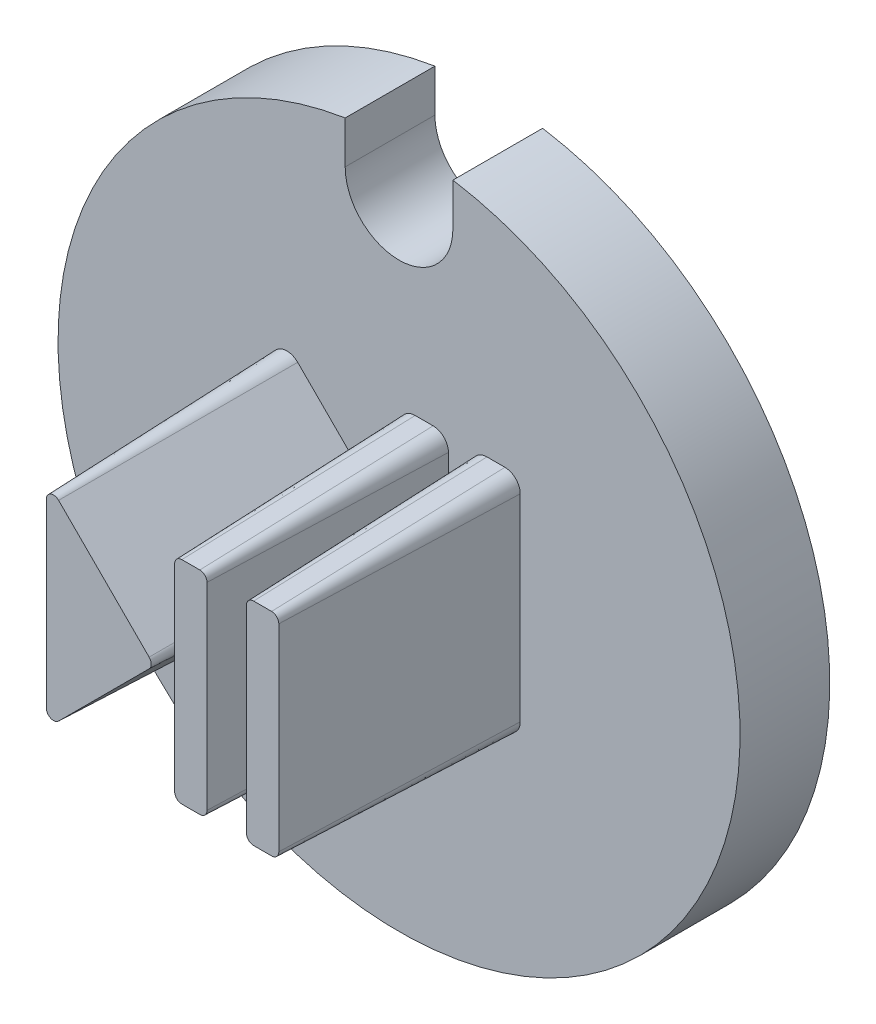
ISO-10303-21;
HEADER;
FILE_DESCRIPTION(('STEP AP214'),'2;1');
FILE_NAME('part.step','',(''),(''),'','','');
FILE_SCHEMA(('AUTOMOTIVE_DESIGN { 1 0 10303 214 1 1 1 1 }'));
ENDSEC;
DATA;
#1=APPLICATION_CONTEXT('core data for automotive mechanical design processes');
#2=APPLICATION_PROTOCOL_DEFINITION('international standard','automotive_design',2000,#1);
#3=PRODUCT_CONTEXT('',#1,'mechanical');
#4=PRODUCT('Part','Part','',(#3));
#5=PRODUCT_RELATED_PRODUCT_CATEGORY('part','',(#4));
#6=PRODUCT_DEFINITION_FORMATION('','',#4);
#7=PRODUCT_DEFINITION_CONTEXT('part definition',#1,'design');
#8=PRODUCT_DEFINITION('design','',#6,#7);
#9=PRODUCT_DEFINITION_SHAPE('','',#8);
#10=(LENGTH_UNIT() NAMED_UNIT(*) SI_UNIT(.MILLI.,.METRE.));
#11=(NAMED_UNIT(*) PLANE_ANGLE_UNIT() SI_UNIT($,.RADIAN.));
#12=(NAMED_UNIT(*) SI_UNIT($,.STERADIAN.) SOLID_ANGLE_UNIT());
#13=UNCERTAINTY_MEASURE_WITH_UNIT(LENGTH_MEASURE(1.E-05),#10,'distance_accuracy_value','');
#14=(GEOMETRIC_REPRESENTATION_CONTEXT(3) GLOBAL_UNCERTAINTY_ASSIGNED_CONTEXT((#13)) GLOBAL_UNIT_ASSIGNED_CONTEXT((#10,
#11,#12)) REPRESENTATION_CONTEXT('',''));
#15=CARTESIAN_POINT('',(0.,0.,0.));
#16=DIRECTION('',(0.,0.,1.));
#17=DIRECTION('',(1.,0.,0.));
#18=AXIS2_PLACEMENT_3D('',#15,#16,#17);
#19=CARTESIAN_POINT('',(0.,-2.95,9.));
#20=DIRECTION('',(0.,-0.999390827019096,0.0348994967025009));
#21=DIRECTION('',(0.,-0.0348994967025009,-0.999390827019096));
#22=AXIS2_PLACEMENT_3D('',#19,#20,#21);
#23=PLANE('',#22);
#24=DIRECTION('',(1.,0.,0.));
#25=VECTOR('',#24,1.);
#26=CARTESIAN_POINT('',(0.,-3.17698500169636,2.5));
#27=LINE('',#26,#25);
#28=CARTESIAN_POINT('',(2.45,-3.17698500169711,2.50000000001251));
#29=VERTEX_POINT('',#28);
#30=CARTESIAN_POINT('',(2.95,-3.17698500169978,2.50000000001251));
#31=VERTEX_POINT('',#30);
#32=EDGE_CURVE('E188',#29,#31,#27,.T.);
#33=ORIENTED_EDGE('',*,*,#32,.T.);
#34=DIRECTION('',(0.,0.034899496702501,0.999390827019096));
#35=VECTOR('',#34,1.);
#36=CARTESIAN_POINT('',(2.95000000000107,-17428.7282633076,-499000.));
#37=LINE('',#36,#35);
#38=CARTESIAN_POINT('',(2.95,-2.95000000000204,9.00000000001091));
#39=VERTEX_POINT('',#38);
#40=EDGE_CURVE('E190',#39,#31,#37,.F.);
#41=ORIENTED_EDGE('',*,*,#40,.F.);
#42=DIRECTION('',(1.,0.,0.));
#43=VECTOR('',#42,1.);
#44=CARTESIAN_POINT('',(0.,-2.95,9.));
#45=LINE('',#44,#43);
#46=CARTESIAN_POINT('',(2.45,-2.94999999999961,9.00000000001091));
#47=VERTEX_POINT('',#46);
#48=EDGE_CURVE('E197',#39,#47,#45,.F.);
#49=ORIENTED_EDGE('',*,*,#48,.T.);
#50=DIRECTION('',(0.,0.034899496702501,0.999390827019096));
#51=VECTOR('',#50,1.);
#52=CARTESIAN_POINT('',(2.45000000000107,-17428.7282633076,-499000.));
#53=LINE('',#52,#51);
#54=EDGE_CURVE('E193',#29,#47,#53,.T.);
#55=ORIENTED_EDGE('',*,*,#54,.F.);
#56=EDGE_LOOP('',(#33,#41,#49,#55));
#57=FACE_BOUND('',#56,.T.);
#58=ADVANCED_FACE('F17',(#57),#23,.T.);
#59=CARTESIAN_POINT('',(0.,2.95,9.));
#60=DIRECTION('',(0.,0.999390827019096,0.0348994967025009));
#61=DIRECTION('',(0.,-0.0348994967025009,0.999390827019096));
#62=AXIS2_PLACEMENT_3D('',#59,#60,#61);
#63=PLANE('',#62);
#64=DIRECTION('',(0.,-0.034899496702501,0.999390827019096));
#65=VECTOR('',#64,1.);
#66=CARTESIAN_POINT('',(2.9499999999968,17428.7282633076,-499000.));
#67=LINE('',#66,#65);
#68=CARTESIAN_POINT('',(2.95,3.17698500169978,2.50000000001251));
#69=VERTEX_POINT('',#68);
#70=CARTESIAN_POINT('',(2.95,2.95000000000204,9.00000000001091));
#71=VERTEX_POINT('',#70);
#72=EDGE_CURVE('E214',#69,#71,#67,.T.);
#73=ORIENTED_EDGE('',*,*,#72,.F.);
#74=DIRECTION('',(1.,0.,0.));
#75=VECTOR('',#74,1.);
#76=CARTESIAN_POINT('',(0.,3.17698500169636,2.5));
#77=LINE('',#76,#75);
#78=CARTESIAN_POINT('',(2.45,3.17698500169711,2.50000000001251));
#79=VERTEX_POINT('',#78);
#80=EDGE_CURVE('E196',#69,#79,#77,.F.);
#81=ORIENTED_EDGE('',*,*,#80,.T.);
#82=DIRECTION('',(0.,-0.034899496702501,0.999390827019096));
#83=VECTOR('',#82,1.);
#84=CARTESIAN_POINT('',(2.4499999999968,17428.7282633076,-499000.));
#85=LINE('',#84,#83);
#86=CARTESIAN_POINT('',(2.45,2.94999999999961,9.00000000001091));
#87=VERTEX_POINT('',#86);
#88=EDGE_CURVE('E233',#87,#79,#85,.F.);
#89=ORIENTED_EDGE('',*,*,#88,.F.);
#90=DIRECTION('',(1.,0.,0.));
#91=VECTOR('',#90,1.);
#92=CARTESIAN_POINT('',(0.,2.95,9.));
#93=LINE('',#92,#91);
#94=EDGE_CURVE('E226',#71,#87,#93,.F.);
#95=ORIENTED_EDGE('',*,*,#94,.F.);
#96=EDGE_LOOP('',(#73,#81,#89,#95));
#97=FACE_BOUND('',#96,.T.);
#98=ADVANCED_FACE('F665',(#97),#63,.T.);
#99=CARTESIAN_POINT('',(0.,-2.95,9.));
#100=DIRECTION('',(0.,-0.999390827019096,0.0348994967025009));
#101=DIRECTION('',(0.,-0.0348994967025009,-0.999390827019096));
#102=AXIS2_PLACEMENT_3D('',#99,#100,#101);
#103=PLANE('',#102);
#104=DIRECTION('',(0.,0.034899496702501,0.999390827019096));
#105=VECTOR('',#104,1.);
#106=CARTESIAN_POINT('',(0.450000000001067,-17428.7282633075,-499000.));
#107=LINE('',#106,#105);
#108=CARTESIAN_POINT('',(0.45,-3.17698500169978,2.50000000001251));
#109=VERTEX_POINT('',#108);
#110=CARTESIAN_POINT('',(0.45,-2.95000000000204,9.00000000001091));
#111=VERTEX_POINT('',#110);
#112=EDGE_CURVE('E243',#109,#111,#107,.T.);
#113=ORIENTED_EDGE('',*,*,#112,.F.);
#114=DIRECTION('',(1.,0.,0.));
#115=VECTOR('',#114,1.);
#116=CARTESIAN_POINT('',(0.,-3.17698500169636,2.5));
#117=LINE('',#116,#115);
#118=CARTESIAN_POINT('',(0.95,-3.17698500169711,2.50000000001251));
#119=VERTEX_POINT('',#118);
#120=EDGE_CURVE('E293',#109,#119,#117,.T.);
#121=ORIENTED_EDGE('',*,*,#120,.T.);
#122=DIRECTION('',(0.,0.034899496702501,0.999390827019096));
#123=VECTOR('',#122,1.);
#124=CARTESIAN_POINT('',(0.950000000001067,-17428.7282633075,-499000.));
#125=LINE('',#124,#123);
#126=CARTESIAN_POINT('',(0.95,-2.94999999999961,9.00000000001091));
#127=VERTEX_POINT('',#126);
#128=EDGE_CURVE('E236',#127,#119,#125,.F.);
#129=ORIENTED_EDGE('',*,*,#128,.F.);
#130=DIRECTION('',(1.,0.,0.));
#131=VECTOR('',#130,1.);
#132=CARTESIAN_POINT('',(0.,-2.95,9.));
#133=LINE('',#132,#131);
#134=EDGE_CURVE('E289',#127,#111,#133,.F.);
#135=ORIENTED_EDGE('',*,*,#134,.T.);
#136=EDGE_LOOP('',(#113,#121,#129,#135));
#137=FACE_BOUND('',#136,.T.);
#138=ADVANCED_FACE('F656',(#137),#103,.T.);
#139=CARTESIAN_POINT('',(0.,2.95,9.));
#140=DIRECTION('',(0.,0.999390827019096,0.0348994967025009));
#141=DIRECTION('',(0.,-0.0348994967025009,0.999390827019096));
#142=AXIS2_PLACEMENT_3D('',#139,#140,#141);
#143=PLANE('',#142);
#144=DIRECTION('',(1.,0.,0.));
#145=VECTOR('',#144,1.);
#146=CARTESIAN_POINT('',(0.,3.17698500169636,2.5));
#147=LINE('',#146,#145);
#148=CARTESIAN_POINT('',(0.95,3.17698500169711,2.50000000001251));
#149=VERTEX_POINT('',#148);
#150=CARTESIAN_POINT('',(0.45,3.17698500169978,2.50000000001251));
#151=VERTEX_POINT('',#150);
#152=EDGE_CURVE('E205',#149,#151,#147,.F.);
#153=ORIENTED_EDGE('',*,*,#152,.T.);
#154=DIRECTION('',(0.,-0.034899496702501,0.999390827019096));
#155=VECTOR('',#154,1.);
#156=CARTESIAN_POINT('',(0.449999999996799,17428.7282633075,-499000.));
#157=LINE('',#156,#155);
#158=CARTESIAN_POINT('',(0.45,2.95000000000204,9.00000000001091));
#159=VERTEX_POINT('',#158);
#160=EDGE_CURVE('E259',#159,#151,#157,.F.);
#161=ORIENTED_EDGE('',*,*,#160,.F.);
#162=DIRECTION('',(1.,0.,0.));
#163=VECTOR('',#162,1.);
#164=CARTESIAN_POINT('',(0.,2.95,9.));
#165=LINE('',#164,#163);
#166=CARTESIAN_POINT('',(0.95,2.94999999999961,9.00000000001091));
#167=VERTEX_POINT('',#166);
#168=EDGE_CURVE('E250',#167,#159,#165,.F.);
#169=ORIENTED_EDGE('',*,*,#168,.F.);
#170=DIRECTION('',(0.,-0.034899496702501,0.999390827019096));
#171=VECTOR('',#170,1.);
#172=CARTESIAN_POINT('',(0.949999999996799,17428.7282633075,-499000.));
#173=LINE('',#172,#171);
#174=EDGE_CURVE('E239',#149,#167,#173,.T.);
#175=ORIENTED_EDGE('',*,*,#174,.F.);
#176=EDGE_LOOP('',(#153,#161,#169,#175));
#177=FACE_BOUND('',#176,.T.);
#178=ADVANCED_FACE('F648',(#177),#143,.T.);
#179=CARTESIAN_POINT('',(2.95,-2.75,2.50000000005457));
#180=DIRECTION('',(0.,0.,-1.));
#181=DIRECTION('',(-1.,0.,0.));
#182=AXIS2_PLACEMENT_3D('',#179,#180,#181);
#183=CONICAL_SURFACE('',#182,0.426985001697364,0.0349065850400188);
#184=CARTESIAN_POINT('',(2.95,-2.75,2.49999999999773));
#185=DIRECTION('',(0.,0.,-1.));
#186=DIRECTION('',(-1.,0.,0.));
#187=AXIS2_PLACEMENT_3D('',#184,#185,#186);
#188=CIRCLE('',#187,0.426985001699349);
#189=CARTESIAN_POINT('',(3.3769850016964,-2.75,2.49999999999886));
#190=VERTEX_POINT('',#189);
#191=EDGE_CURVE('E20',#31,#190,#188,.F.);
#192=ORIENTED_EDGE('',*,*,#191,.T.);
#193=DIRECTION('',(0.0348994967025009,0.,-0.999390827019096));
#194=VECTOR('',#193,1.);
#195=CARTESIAN_POINT('',(3.15,-2.75,9.));
#196=LINE('',#195,#194);
#197=CARTESIAN_POINT('',(3.14999999999975,-2.75,9.00000000000728));
#198=VERTEX_POINT('',#197);
#199=EDGE_CURVE('E305',#198,#190,#196,.T.);
#200=ORIENTED_EDGE('',*,*,#199,.F.);
#201=CARTESIAN_POINT('',(2.95,-2.75,9.00000000001455));
#202=DIRECTION('',(0.,0.,-1.));
#203=DIRECTION('',(-1.,0.,0.));
#204=AXIS2_PLACEMENT_3D('',#201,#202,#203);
#205=CIRCLE('',#204,0.20000000000154);
#206=EDGE_CURVE('E204',#39,#198,#205,.F.);
#207=ORIENTED_EDGE('',*,*,#206,.F.);
#208=ORIENTED_EDGE('',*,*,#40,.T.);
#209=EDGE_LOOP('',(#192,#200,#207,#208));
#210=FACE_BOUND('',#209,.T.);
#211=ADVANCED_FACE('F201',(#210),#183,.T.);
#212=CARTESIAN_POINT('',(2.95,2.75,2.50000000005457));
#213=DIRECTION('',(0.,0.,-1.));
#214=DIRECTION('',(-1.,0.,0.));
#215=AXIS2_PLACEMENT_3D('',#212,#213,#214);
#216=CONICAL_SURFACE('',#215,0.426985001697364,0.0349065850400188);
#217=CARTESIAN_POINT('',(2.95,2.75,2.49999999999773));
#218=DIRECTION('',(0.,0.,-1.));
#219=DIRECTION('',(-1.,0.,0.));
#220=AXIS2_PLACEMENT_3D('',#217,#218,#219);
#221=CIRCLE('',#220,0.426985001699349);
#222=CARTESIAN_POINT('',(3.3769850016964,2.75,2.49999999999886));
#223=VERTEX_POINT('',#222);
#224=EDGE_CURVE('E213',#223,#69,#221,.F.);
#225=ORIENTED_EDGE('',*,*,#224,.T.);
#226=ORIENTED_EDGE('',*,*,#72,.T.);
#227=CARTESIAN_POINT('',(2.95,2.75,9.00000000001455));
#228=DIRECTION('',(0.,0.,-1.));
#229=DIRECTION('',(-1.,0.,0.));
#230=AXIS2_PLACEMENT_3D('',#227,#228,#229);
#231=CIRCLE('',#230,0.20000000000154);
#232=CARTESIAN_POINT('',(3.14999999999975,2.75,9.00000000000728));
#233=VERTEX_POINT('',#232);
#234=EDGE_CURVE('E223',#233,#71,#231,.F.);
#235=ORIENTED_EDGE('',*,*,#234,.F.);
#236=DIRECTION('',(0.0348994967025009,0.,-0.999390827019096));
#237=VECTOR('',#236,1.);
#238=CARTESIAN_POINT('',(3.15,2.75,9.));
#239=LINE('',#238,#237);
#240=EDGE_CURVE('E335',#223,#233,#239,.F.);
#241=ORIENTED_EDGE('',*,*,#240,.F.);
#242=EDGE_LOOP('',(#225,#226,#235,#241));
#243=FACE_BOUND('',#242,.T.);
#244=ADVANCED_FACE('F632',(#243),#216,.T.);
#245=CARTESIAN_POINT('',(2.45,-2.75,2.50000000005457));
#246=DIRECTION('',(0.,0.,-1.));
#247=DIRECTION('',(-1.,0.,0.));
#248=AXIS2_PLACEMENT_3D('',#245,#246,#247);
#249=CONICAL_SURFACE('',#248,0.426985001694976,0.0349065850400188);
#250=CARTESIAN_POINT('',(2.45,-2.75,2.49999999999773));
#251=DIRECTION('',(0.,0.,-1.));
#252=DIRECTION('',(-1.,0.,0.));
#253=AXIS2_PLACEMENT_3D('',#250,#251,#252);
#254=CIRCLE('',#253,0.426985001696961);
#255=CARTESIAN_POINT('',(2.0230149983036,-2.75,2.49999999999886));
#256=VERTEX_POINT('',#255);
#257=EDGE_CURVE('E218',#256,#29,#254,.F.);
#258=ORIENTED_EDGE('',*,*,#257,.T.);
#259=ORIENTED_EDGE('',*,*,#54,.T.);
#260=CARTESIAN_POINT('',(2.45,-2.75,9.00000000001455));
#261=DIRECTION('',(0.,0.,-1.));
#262=DIRECTION('',(-1.,0.,0.));
#263=AXIS2_PLACEMENT_3D('',#260,#261,#262);
#264=CIRCLE('',#263,0.199999999999153);
#265=CARTESIAN_POINT('',(2.25000000000025,-2.75,9.00000000000728));
#266=VERTEX_POINT('',#265);
#267=EDGE_CURVE('E227',#266,#47,#264,.F.);
#268=ORIENTED_EDGE('',*,*,#267,.F.);
#269=DIRECTION('',(0.0348994967025009,0.,0.999390827019096));
#270=VECTOR('',#269,1.);
#271=CARTESIAN_POINT('',(2.25,-2.75,9.));
#272=LINE('',#271,#270);
#273=EDGE_CURVE('E310',#256,#266,#272,.T.);
#274=ORIENTED_EDGE('',*,*,#273,.F.);
#275=EDGE_LOOP('',(#258,#259,#268,#274));
#276=FACE_BOUND('',#275,.T.);
#277=ADVANCED_FACE('F623',(#276),#249,.T.);
#278=CARTESIAN_POINT('',(0.,-0.059584240176571,9.));
#279=DIRECTION('',(0.,0.,1.));
#280=DIRECTION('',(1.,0.,0.));
#281=AXIS2_PLACEMENT_3D('',#278,#279,#280);
#282=PLANE('',#281);
#283=ORIENTED_EDGE('',*,*,#267,.T.);
#284=ORIENTED_EDGE('',*,*,#48,.F.);
#285=ORIENTED_EDGE('',*,*,#206,.T.);
#286=DIRECTION('',(0.,1.,0.));
#287=VECTOR('',#286,1.);
#288=CARTESIAN_POINT('',(3.15,-0.0595842401765715,9.));
#289=LINE('',#288,#287);
#290=EDGE_CURVE('E274',#233,#198,#289,.F.);
#291=ORIENTED_EDGE('',*,*,#290,.F.);
#292=ORIENTED_EDGE('',*,*,#234,.T.);
#293=ORIENTED_EDGE('',*,*,#94,.T.);
#294=CARTESIAN_POINT('',(2.45,2.75,9.00000000001455));
#295=DIRECTION('',(0.,0.,-1.));
#296=DIRECTION('',(-1.,0.,0.));
#297=AXIS2_PLACEMENT_3D('',#294,#295,#296);
#298=CIRCLE('',#297,0.199999999999153);
#299=CARTESIAN_POINT('',(2.25000000000025,2.75,9.00000000000728));
#300=VERTEX_POINT('',#299);
#301=EDGE_CURVE('E230',#300,#87,#298,.T.);
#302=ORIENTED_EDGE('',*,*,#301,.F.);
#303=DIRECTION('',(0.,1.,0.));
#304=VECTOR('',#303,1.);
#305=CARTESIAN_POINT('',(2.25,-0.0595842401765714,9.));
#306=LINE('',#305,#304);
#307=EDGE_CURVE('E307',#266,#300,#306,.T.);
#308=ORIENTED_EDGE('',*,*,#307,.F.);
#309=EDGE_LOOP('',(#283,#284,#285,#291,#292,#293,#302,#308));
#310=FACE_BOUND('',#309,.T.);
#311=ADVANCED_FACE('F614',(#310),#282,.T.);
#312=CARTESIAN_POINT('',(2.45,2.75,2.50000000005457));
#313=DIRECTION('',(0.,0.,-1.));
#314=DIRECTION('',(-1.,0.,0.));
#315=AXIS2_PLACEMENT_3D('',#312,#313,#314);
#316=CONICAL_SURFACE('',#315,0.426985001694976,0.0349065850400188);
#317=CARTESIAN_POINT('',(2.45,2.75,2.49999999999773));
#318=DIRECTION('',(0.,0.,-1.));
#319=DIRECTION('',(-1.,0.,0.));
#320=AXIS2_PLACEMENT_3D('',#317,#318,#319);
#321=CIRCLE('',#320,0.426985001696961);
#322=CARTESIAN_POINT('',(2.0230149983036,2.75,2.49999999999886));
#323=VERTEX_POINT('',#322);
#324=EDGE_CURVE('E234',#79,#323,#321,.F.);
#325=ORIENTED_EDGE('',*,*,#324,.T.);
#326=DIRECTION('',(0.0348994967025009,0.,0.999390827019096));
#327=VECTOR('',#326,1.);
#328=CARTESIAN_POINT('',(2.25,2.75,9.));
#329=LINE('',#328,#327);
#330=EDGE_CURVE('E309',#300,#323,#329,.F.);
#331=ORIENTED_EDGE('',*,*,#330,.F.);
#332=ORIENTED_EDGE('',*,*,#301,.T.);
#333=ORIENTED_EDGE('',*,*,#88,.T.);
#334=EDGE_LOOP('',(#325,#331,#332,#333));
#335=FACE_BOUND('',#334,.T.);
#336=ADVANCED_FACE('F605',(#335),#316,.T.);
#337=CARTESIAN_POINT('',(0.95,-2.75,2.50000000005457));
#338=DIRECTION('',(0.,0.,-1.));
#339=DIRECTION('',(-1.,0.,0.));
#340=AXIS2_PLACEMENT_3D('',#337,#338,#339);
#341=CONICAL_SURFACE('',#340,0.426985001694919,0.0349065850400188);
#342=ORIENTED_EDGE('',*,*,#128,.T.);
#343=CARTESIAN_POINT('',(0.95,-2.75,2.49999999999773));
#344=DIRECTION('',(0.,0.,-1.));
#345=DIRECTION('',(-1.,0.,0.));
#346=AXIS2_PLACEMENT_3D('',#343,#344,#345);
#347=CIRCLE('',#346,0.426985001696904);
#348=CARTESIAN_POINT('',(1.3769850016964,-2.75,2.49999999999886));
#349=VERTEX_POINT('',#348);
#350=EDGE_CURVE('E237',#119,#349,#347,.F.);
#351=ORIENTED_EDGE('',*,*,#350,.T.);
#352=DIRECTION('',(0.0348994967025009,0.,-0.999390827019096));
#353=VECTOR('',#352,1.);
#354=CARTESIAN_POINT('',(1.15,-2.75,9.));
#355=LINE('',#354,#353);
#356=CARTESIAN_POINT('',(1.14999999999975,-2.75,9.00000000000728));
#357=VERTEX_POINT('',#356);
#358=EDGE_CURVE('E314',#357,#349,#355,.T.);
#359=ORIENTED_EDGE('',*,*,#358,.F.);
#360=CARTESIAN_POINT('',(0.95,-2.75,9.00000000001455));
#361=DIRECTION('',(0.,0.,-1.));
#362=DIRECTION('',(-1.,0.,0.));
#363=AXIS2_PLACEMENT_3D('',#360,#361,#362);
#364=CIRCLE('',#363,0.199999999999096);
#365=EDGE_CURVE('E254',#127,#357,#364,.F.);
#366=ORIENTED_EDGE('',*,*,#365,.F.);
#367=EDGE_LOOP('',(#342,#351,#359,#366));
#368=FACE_BOUND('',#367,.T.);
#369=ADVANCED_FACE('F596',(#368),#341,.T.);
#370=CARTESIAN_POINT('',(0.95,2.75,2.50000000005457));
#371=DIRECTION('',(0.,0.,-1.));
#372=DIRECTION('',(-1.,0.,0.));
#373=AXIS2_PLACEMENT_3D('',#370,#371,#372);
#374=CONICAL_SURFACE('',#373,0.426985001694919,0.0349065850400188);
#375=DIRECTION('',(0.0348994967025009,0.,-0.999390827019096));
#376=VECTOR('',#375,1.);
#377=CARTESIAN_POINT('',(1.15,2.75,9.));
#378=LINE('',#377,#376);
#379=CARTESIAN_POINT('',(1.3769850016964,2.75,2.49999999999886));
#380=VERTEX_POINT('',#379);
#381=CARTESIAN_POINT('',(1.14999999999975,2.75,9.00000000000728));
#382=VERTEX_POINT('',#381);
#383=EDGE_CURVE('E343',#380,#382,#378,.F.);
#384=ORIENTED_EDGE('',*,*,#383,.F.);
#385=CARTESIAN_POINT('',(0.95,2.75,2.49999999999773));
#386=DIRECTION('',(0.,0.,-1.));
#387=DIRECTION('',(-1.,0.,0.));
#388=AXIS2_PLACEMENT_3D('',#385,#386,#387);
#389=CIRCLE('',#388,0.426985001696904);
#390=EDGE_CURVE('E240',#380,#149,#389,.F.);
#391=ORIENTED_EDGE('',*,*,#390,.T.);
#392=ORIENTED_EDGE('',*,*,#174,.T.);
#393=CARTESIAN_POINT('',(0.95,2.75,9.00000000001455));
#394=DIRECTION('',(0.,0.,-1.));
#395=DIRECTION('',(-1.,0.,0.));
#396=AXIS2_PLACEMENT_3D('',#393,#394,#395);
#397=CIRCLE('',#396,0.199999999999096);
#398=EDGE_CURVE('E247',#382,#167,#397,.F.);
#399=ORIENTED_EDGE('',*,*,#398,.F.);
#400=EDGE_LOOP('',(#384,#391,#392,#399));
#401=FACE_BOUND('',#400,.T.);
#402=ADVANCED_FACE('F587',(#401),#374,.T.);
#403=CARTESIAN_POINT('',(0.45,-2.75,2.50000000005457));
#404=DIRECTION('',(0.,0.,-1.));
#405=DIRECTION('',(-1.,0.,0.));
#406=AXIS2_PLACEMENT_3D('',#403,#404,#405);
#407=CONICAL_SURFACE('',#406,0.426985001696084,0.0349065850400188);
#408=DIRECTION('',(0.0348994967025009,0.,0.999390827019096));
#409=VECTOR('',#408,1.);
#410=CARTESIAN_POINT('',(0.25,-2.75,9.));
#411=LINE('',#410,#409);
#412=CARTESIAN_POINT('',(0.0230149983036011,-2.75,2.49999999999886));
#413=VERTEX_POINT('',#412);
#414=CARTESIAN_POINT('',(0.250000000000254,-2.75,9.00000000000728));
#415=VERTEX_POINT('',#414);
#416=EDGE_CURVE('E319',#413,#415,#411,.T.);
#417=ORIENTED_EDGE('',*,*,#416,.F.);
#418=CARTESIAN_POINT('',(0.45,-2.75,2.49999999999773));
#419=DIRECTION('',(0.,0.,-1.));
#420=DIRECTION('',(-1.,0.,0.));
#421=AXIS2_PLACEMENT_3D('',#418,#419,#420);
#422=CIRCLE('',#421,0.42698500169807);
#423=EDGE_CURVE('E244',#413,#109,#422,.F.);
#424=ORIENTED_EDGE('',*,*,#423,.T.);
#425=ORIENTED_EDGE('',*,*,#112,.T.);
#426=CARTESIAN_POINT('',(0.45,-2.75,9.00000000001455));
#427=DIRECTION('',(0.,0.,-1.));
#428=DIRECTION('',(-1.,0.,0.));
#429=AXIS2_PLACEMENT_3D('',#426,#427,#428);
#430=CIRCLE('',#429,0.200000000000261);
#431=EDGE_CURVE('E251',#415,#111,#430,.F.);
#432=ORIENTED_EDGE('',*,*,#431,.F.);
#433=EDGE_LOOP('',(#417,#424,#425,#432));
#434=FACE_BOUND('',#433,.T.);
#435=ADVANCED_FACE('F578',(#434),#407,.T.);
#436=CARTESIAN_POINT('',(0.,-0.059584240176571,9.));
#437=DIRECTION('',(0.,0.,1.));
#438=DIRECTION('',(1.,0.,0.));
#439=AXIS2_PLACEMENT_3D('',#436,#437,#438);
#440=PLANE('',#439);
#441=ORIENTED_EDGE('',*,*,#365,.T.);
#442=DIRECTION('',(0.,1.,0.));
#443=VECTOR('',#442,1.);
#444=CARTESIAN_POINT('',(1.15,-0.0595842401765709,9.));
#445=LINE('',#444,#443);
#446=EDGE_CURVE('E311',#382,#357,#445,.F.);
#447=ORIENTED_EDGE('',*,*,#446,.F.);
#448=ORIENTED_EDGE('',*,*,#398,.T.);
#449=ORIENTED_EDGE('',*,*,#168,.T.);
#450=CARTESIAN_POINT('',(0.45,2.75,9.00000000001455));
#451=DIRECTION('',(0.,0.,-1.));
#452=DIRECTION('',(-1.,0.,0.));
#453=AXIS2_PLACEMENT_3D('',#450,#451,#452);
#454=CIRCLE('',#453,0.200000000000261);
#455=CARTESIAN_POINT('',(0.250000000000254,2.75,9.00000000000728));
#456=VERTEX_POINT('',#455);
#457=EDGE_CURVE('E256',#456,#159,#454,.T.);
#458=ORIENTED_EDGE('',*,*,#457,.F.);
#459=DIRECTION('',(0.,1.,0.));
#460=VECTOR('',#459,1.);
#461=CARTESIAN_POINT('',(0.25,-0.059584240176571,9.));
#462=LINE('',#461,#460);
#463=EDGE_CURVE('E316',#415,#456,#462,.T.);
#464=ORIENTED_EDGE('',*,*,#463,.F.);
#465=ORIENTED_EDGE('',*,*,#431,.T.);
#466=ORIENTED_EDGE('',*,*,#134,.F.);
#467=EDGE_LOOP('',(#441,#447,#448,#449,#458,#464,#465,#466));
#468=FACE_BOUND('',#467,.T.);
#469=ADVANCED_FACE('F569',(#468),#440,.T.);
#470=CARTESIAN_POINT('',(0.45,2.75,2.50000000005457));
#471=DIRECTION('',(0.,0.,-1.));
#472=DIRECTION('',(-1.,0.,0.));
#473=AXIS2_PLACEMENT_3D('',#470,#471,#472);
#474=CONICAL_SURFACE('',#473,0.426985001696084,0.0349065850400188);
#475=ORIENTED_EDGE('',*,*,#160,.T.);
#476=CARTESIAN_POINT('',(0.45,2.75,2.49999999999773));
#477=DIRECTION('',(0.,0.,-1.));
#478=DIRECTION('',(-1.,0.,0.));
#479=AXIS2_PLACEMENT_3D('',#476,#477,#478);
#480=CIRCLE('',#479,0.42698500169807);
#481=CARTESIAN_POINT('',(0.0230149983036006,2.75,2.49999999999886));
#482=VERTEX_POINT('',#481);
#483=EDGE_CURVE('E260',#151,#482,#480,.F.);
#484=ORIENTED_EDGE('',*,*,#483,.T.);
#485=DIRECTION('',(0.0348994967025009,0.,0.999390827019096));
#486=VECTOR('',#485,1.);
#487=CARTESIAN_POINT('',(0.25,2.75,9.));
#488=LINE('',#487,#486);
#489=EDGE_CURVE('E318',#456,#482,#488,.F.);
#490=ORIENTED_EDGE('',*,*,#489,.F.);
#491=ORIENTED_EDGE('',*,*,#457,.T.);
#492=EDGE_LOOP('',(#475,#484,#490,#491));
#493=FACE_BOUND('',#492,.T.);
#494=ADVANCED_FACE('F560',(#493),#474,.T.);
#495=CARTESIAN_POINT('',(-0.603553390593274,0.,2.50000000005457));
#496=DIRECTION('',(0.,0.,-1.));
#497=DIRECTION('',(-1.,0.,0.));
#498=AXIS2_PLACEMENT_3D('',#495,#496,#497);
#499=CONICAL_SURFACE('',#498,0.426985001694928,0.0349065850400188);
#500=DIRECTION('',(-0.0246776707783359,0.024677670778336,0.999390827019096));
#501=VECTOR('',#500,1.);
#502=CARTESIAN_POINT('',(-0.462132034355965,-0.14142135623731,9.));
#503=LINE('',#502,#501);
#504=CARTESIAN_POINT('',(-0.301629400428801,-0.301923990164474,2.49999999999886));
#505=VERTEX_POINT('',#504);
#506=CARTESIAN_POINT('',(-0.462132034356145,-0.14142135623713,9.00000000000728));
#507=VERTEX_POINT('',#506);
#508=EDGE_CURVE('E329',#505,#507,#503,.T.);
#509=ORIENTED_EDGE('',*,*,#508,.F.);
#510=CARTESIAN_POINT('',(-0.603553390593274,0.,2.49999999999773));
#511=DIRECTION('',(0.,0.,-1.));
#512=DIRECTION('',(-1.,0.,0.));
#513=AXIS2_PLACEMENT_3D('',#510,#511,#512);
#514=CIRCLE('',#513,0.426985001696913);
#515=CARTESIAN_POINT('',(-0.3016294004288,0.301923990164473,2.49999999999886));
#516=VERTEX_POINT('',#515);
#517=EDGE_CURVE('E262',#505,#516,#514,.F.);
#518=ORIENTED_EDGE('',*,*,#517,.T.);
#519=DIRECTION('',(-0.0246776707783359,-0.0246776707783359,0.999390827019096));
#520=VECTOR('',#519,1.);
#521=CARTESIAN_POINT('',(-0.462132034355964,0.141421356237309,9.));
#522=LINE('',#521,#520);
#523=CARTESIAN_POINT('',(-0.462132034356144,0.141421356237129,9.00000000000728));
#524=VERTEX_POINT('',#523);
#525=EDGE_CURVE('E323',#524,#516,#522,.F.);
#526=ORIENTED_EDGE('',*,*,#525,.F.);
#527=CARTESIAN_POINT('',(-0.603553390593274,0.,9.00000000001455));
#528=DIRECTION('',(0.,0.,-1.));
#529=DIRECTION('',(-1.,0.,0.));
#530=AXIS2_PLACEMENT_3D('',#527,#528,#529);
#531=CIRCLE('',#530,0.199999999999105);
#532=EDGE_CURVE('E266',#507,#524,#531,.F.);
#533=ORIENTED_EDGE('',*,*,#532,.F.);
#534=EDGE_LOOP('',(#509,#518,#526,#533));
#535=FACE_BOUND('',#534,.T.);
#536=ADVANCED_FACE('F551',(#535),#499,.T.);
#537=CARTESIAN_POINT('',(-3.125,-2.52144660940672,2.50000000005457));
#538=DIRECTION('',(0.,0.,-1.));
#539=DIRECTION('',(-1.,0.,0.));
#540=AXIS2_PLACEMENT_3D('',#537,#538,#539);
#541=CONICAL_SURFACE('',#540,0.426985001694647,0.0349065850400188);
#542=DIRECTION('',(0.0348994967025009,0.,0.999390827019096));
#543=VECTOR('',#542,1.);
#544=CARTESIAN_POINT('',(-3.325,-2.52144660940672,9.));
#545=LINE('',#544,#543);
#546=CARTESIAN_POINT('',(-3.5519850016964,-2.52144660940672,2.49999999999886));
#547=VERTEX_POINT('',#546);
#548=CARTESIAN_POINT('',(-3.32499999999975,-2.52144660940672,9.00000000000728));
#549=VERTEX_POINT('',#548);
#550=EDGE_CURVE('E333',#547,#549,#545,.T.);
#551=ORIENTED_EDGE('',*,*,#550,.F.);
#552=CARTESIAN_POINT('',(-3.125,-2.52144660940672,2.49999999999773));
#553=DIRECTION('',(0.,0.,-1.));
#554=DIRECTION('',(-1.,0.,0.));
#555=AXIS2_PLACEMENT_3D('',#552,#553,#554);
#556=CIRCLE('',#555,0.426985001696632);
#557=CARTESIAN_POINT('',(-2.82307600983552,-2.8233705995712,2.49999999999886));
#558=VERTEX_POINT('',#557);
#559=EDGE_CURVE('E264',#547,#558,#556,.F.);
#560=ORIENTED_EDGE('',*,*,#559,.T.);
#561=DIRECTION('',(-0.0246776707783359,0.024677670778336,0.999390827019096));
#562=VECTOR('',#561,1.);
#563=CARTESIAN_POINT('',(-2.98357864376269,-2.66286796564403,9.));
#564=LINE('',#563,#562);
#565=CARTESIAN_POINT('',(-2.98357864376287,-2.66286796564385,9.00000000000728));
#566=VERTEX_POINT('',#565);
#567=EDGE_CURVE('E328',#566,#558,#564,.F.);
#568=ORIENTED_EDGE('',*,*,#567,.F.);
#569=CARTESIAN_POINT('',(-3.125,-2.52144660940672,9.00000000001455));
#570=DIRECTION('',(0.,0.,-1.));
#571=DIRECTION('',(-1.,0.,0.));
#572=AXIS2_PLACEMENT_3D('',#569,#570,#571);
#573=CIRCLE('',#572,0.199999999998823);
#574=EDGE_CURVE('E268',#549,#566,#573,.F.);
#575=ORIENTED_EDGE('',*,*,#574,.F.);
#576=EDGE_LOOP('',(#551,#560,#568,#575));
#577=FACE_BOUND('',#576,.T.);
#578=ADVANCED_FACE('F542',(#577),#541,.T.);
#579=CARTESIAN_POINT('',(0.,-0.059584240176571,9.));
#580=DIRECTION('',(0.,0.,1.));
#581=DIRECTION('',(1.,0.,0.));
#582=AXIS2_PLACEMENT_3D('',#579,#580,#581);
#583=PLANE('',#582);
#584=ORIENTED_EDGE('',*,*,#574,.T.);
#585=DIRECTION('',(0.707106781186548,0.707106781186547,0.));
#586=VECTOR('',#585,1.);
#587=CARTESIAN_POINT('',(-0.190147459147613,0.130563218971042,9.));
#588=LINE('',#587,#586);
#589=EDGE_CURVE('E325',#507,#566,#588,.F.);
#590=ORIENTED_EDGE('',*,*,#589,.F.);
#591=ORIENTED_EDGE('',*,*,#532,.T.);
#592=DIRECTION('',(-0.707106781186547,0.707106781186547,0.));
#593=VECTOR('',#592,1.);
#594=CARTESIAN_POINT('',(-0.130563218971042,-0.190147459147613,9.));
#595=LINE('',#594,#593);
#596=CARTESIAN_POINT('',(-2.98357864376287,2.66286796564386,9.00000000000728));
#597=VERTEX_POINT('',#596);
#598=EDGE_CURVE('E320',#597,#524,#595,.F.);
#599=ORIENTED_EDGE('',*,*,#598,.F.);
#600=CARTESIAN_POINT('',(-3.125,2.52144660940672,9.00000000001455));
#601=DIRECTION('',(0.,0.,-1.));
#602=DIRECTION('',(-1.,0.,0.));
#603=AXIS2_PLACEMENT_3D('',#600,#601,#602);
#604=CIRCLE('',#603,0.199999999998823);
#605=CARTESIAN_POINT('',(-3.32499999999975,2.52144660940672,9.00000000000728));
#606=VERTEX_POINT('',#605);
#607=EDGE_CURVE('E270',#606,#597,#604,.T.);
#608=ORIENTED_EDGE('',*,*,#607,.F.);
#609=DIRECTION('',(0.,1.,0.));
#610=VECTOR('',#609,1.);
#611=CARTESIAN_POINT('',(-3.325,-0.0595842401765705,9.));
#612=LINE('',#611,#610);
#613=EDGE_CURVE('E330',#549,#606,#612,.T.);
#614=ORIENTED_EDGE('',*,*,#613,.F.);
#615=EDGE_LOOP('',(#584,#590,#591,#599,#608,#614));
#616=FACE_BOUND('',#615,.T.);
#617=ADVANCED_FACE('F533',(#616),#583,.T.);
#618=CARTESIAN_POINT('',(-3.125,2.52144660940672,2.50000000005457));
#619=DIRECTION('',(0.,0.,-1.));
#620=DIRECTION('',(-1.,0.,0.));
#621=AXIS2_PLACEMENT_3D('',#618,#619,#620);
#622=CONICAL_SURFACE('',#621,0.426985001694647,0.0349065850400188);
#623=DIRECTION('',(-0.0246776707783359,-0.0246776707783359,0.999390827019096));
#624=VECTOR('',#623,1.);
#625=CARTESIAN_POINT('',(-2.98357864376269,2.66286796564404,9.));
#626=LINE('',#625,#624);
#627=CARTESIAN_POINT('',(-2.82307600983553,2.8233705995712,2.49999999999886));
#628=VERTEX_POINT('',#627);
#629=EDGE_CURVE('E324',#628,#597,#626,.T.);
#630=ORIENTED_EDGE('',*,*,#629,.F.);
#631=CARTESIAN_POINT('',(-3.125,2.52144660940672,2.49999999999773));
#632=DIRECTION('',(0.,0.,-1.));
#633=DIRECTION('',(-1.,0.,0.));
#634=AXIS2_PLACEMENT_3D('',#631,#632,#633);
#635=CIRCLE('',#634,0.426985001696632);
#636=CARTESIAN_POINT('',(-3.5519850016964,2.52144660940672,2.49999999999886));
#637=VERTEX_POINT('',#636);
#638=EDGE_CURVE('E272',#628,#637,#635,.F.);
#639=ORIENTED_EDGE('',*,*,#638,.T.);
#640=DIRECTION('',(0.0348994967025009,0.,0.999390827019096));
#641=VECTOR('',#640,1.);
#642=CARTESIAN_POINT('',(-3.325,2.52144660940672,9.));
#643=LINE('',#642,#641);
#644=EDGE_CURVE('E332',#606,#637,#643,.F.);
#645=ORIENTED_EDGE('',*,*,#644,.F.);
#646=ORIENTED_EDGE('',*,*,#607,.T.);
#647=EDGE_LOOP('',(#630,#639,#645,#646));
#648=FACE_BOUND('',#647,.T.);
#649=ADVANCED_FACE('F524',(#648),#622,.T.);
#650=CARTESIAN_POINT('',(3.15,-0.0595842401765715,9.));
#651=DIRECTION('',(0.999390827019096,0.,0.0348994967025009));
#652=DIRECTION('',(0.0348994967025009,0.,-0.999390827019096));
#653=AXIS2_PLACEMENT_3D('',#650,#651,#652);
#654=PLANE('',#653);
#655=DIRECTION('',(0.,1.,0.));
#656=VECTOR('',#655,1.);
#657=CARTESIAN_POINT('',(3.37698500169636,0.,2.5));
#658=LINE('',#657,#656);
#659=EDGE_CURVE('E212',#223,#190,#658,.F.);
#660=ORIENTED_EDGE('',*,*,#659,.F.);
#661=ORIENTED_EDGE('',*,*,#240,.T.);
#662=ORIENTED_EDGE('',*,*,#290,.T.);
#663=ORIENTED_EDGE('',*,*,#199,.T.);
#664=EDGE_LOOP('',(#660,#661,#662,#663));
#665=FACE_BOUND('',#664,.T.);
#666=ADVANCED_FACE('F515',(#665),#654,.T.);
#667=CARTESIAN_POINT('',(2.25,-0.0595842401765714,9.));
#668=DIRECTION('',(-0.999390827019096,0.,0.0348994967025009));
#669=DIRECTION('',(0.0348994967025009,0.,0.999390827019096));
#670=AXIS2_PLACEMENT_3D('',#667,#668,#669);
#671=PLANE('',#670);
#672=ORIENTED_EDGE('',*,*,#330,.T.);
#673=DIRECTION('',(0.,1.,0.));
#674=VECTOR('',#673,1.);
#675=CARTESIAN_POINT('',(2.02301499830364,0.,2.5));
#676=LINE('',#675,#674);
#677=EDGE_CURVE('E367',#256,#323,#676,.T.);
#678=ORIENTED_EDGE('',*,*,#677,.F.);
#679=ORIENTED_EDGE('',*,*,#273,.T.);
#680=ORIENTED_EDGE('',*,*,#307,.T.);
#681=EDGE_LOOP('',(#672,#678,#679,#680));
#682=FACE_BOUND('',#681,.T.);
#683=ADVANCED_FACE('F506',(#682),#671,.T.);
#684=CARTESIAN_POINT('',(1.15,-0.0595842401765709,9.));
#685=DIRECTION('',(0.999390827019096,0.,0.0348994967025009));
#686=DIRECTION('',(0.0348994967025009,0.,-0.999390827019096));
#687=AXIS2_PLACEMENT_3D('',#684,#685,#686);
#688=PLANE('',#687);
#689=DIRECTION('',(0.,1.,0.));
#690=VECTOR('',#689,1.);
#691=CARTESIAN_POINT('',(1.37698500169636,0.,2.5));
#692=LINE('',#691,#690);
#693=EDGE_CURVE('E370',#380,#349,#692,.F.);
#694=ORIENTED_EDGE('',*,*,#693,.F.);
#695=ORIENTED_EDGE('',*,*,#383,.T.);
#696=ORIENTED_EDGE('',*,*,#446,.T.);
#697=ORIENTED_EDGE('',*,*,#358,.T.);
#698=EDGE_LOOP('',(#694,#695,#696,#697));
#699=FACE_BOUND('',#698,.T.);
#700=ADVANCED_FACE('F497',(#699),#688,.T.);
#701=CARTESIAN_POINT('',(0.25,-0.059584240176571,9.));
#702=DIRECTION('',(-0.999390827019096,0.,0.0348994967025009));
#703=DIRECTION('',(0.0348994967025009,0.,0.999390827019096));
#704=AXIS2_PLACEMENT_3D('',#701,#702,#703);
#705=PLANE('',#704);
#706=ORIENTED_EDGE('',*,*,#489,.T.);
#707=DIRECTION('',(0.,1.,0.));
#708=VECTOR('',#707,1.);
#709=CARTESIAN_POINT('',(0.0230149983036411,0.,2.5));
#710=LINE('',#709,#708);
#711=EDGE_CURVE('E373',#413,#482,#710,.T.);
#712=ORIENTED_EDGE('',*,*,#711,.F.);
#713=ORIENTED_EDGE('',*,*,#416,.T.);
#714=ORIENTED_EDGE('',*,*,#463,.T.);
#715=EDGE_LOOP('',(#706,#712,#713,#714));
#716=FACE_BOUND('',#715,.T.);
#717=ADVANCED_FACE('F488',(#716),#705,.T.);
#718=CARTESIAN_POINT('',(-0.130563218971042,-0.190147459147613,9.));
#719=DIRECTION('',(0.706676030840835,0.706676030840835,0.0348994967025009));
#720=DIRECTION('',(-0.707106781186547,0.707106781186547,0.));
#721=AXIS2_PLACEMENT_3D('',#718,#719,#720);
#722=PLANE('',#721);
#723=ORIENTED_EDGE('',*,*,#525,.T.);
#724=DIRECTION('',(0.707106781186546,-0.707106781186549,0.));
#725=VECTOR('',#724,1.);
#726=CARTESIAN_POINT('',(-2.82307600983555,2.82337059957118,2.5));
#727=LINE('',#726,#725);
#728=EDGE_CURVE('E376',#628,#516,#727,.T.);
#729=ORIENTED_EDGE('',*,*,#728,.F.);
#730=ORIENTED_EDGE('',*,*,#629,.T.);
#731=ORIENTED_EDGE('',*,*,#598,.T.);
#732=EDGE_LOOP('',(#723,#729,#730,#731));
#733=FACE_BOUND('',#732,.T.);
#734=ADVANCED_FACE('F479',(#733),#722,.T.);
#735=CARTESIAN_POINT('',(-0.190147459147613,0.130563218971042,9.));
#736=DIRECTION('',(0.706676030840834,-0.706676030840835,0.0348994967025009));
#737=DIRECTION('',(0.707106781186548,0.707106781186547,0.));
#738=AXIS2_PLACEMENT_3D('',#735,#736,#737);
#739=PLANE('',#738);
#740=ORIENTED_EDGE('',*,*,#567,.T.);
#741=DIRECTION('',(-0.707106781186547,-0.707106781186548,0.));
#742=VECTOR('',#741,1.);
#743=CARTESIAN_POINT('',(-0.301629400428829,-0.301923990164446,2.5));
#744=LINE('',#743,#742);
#745=EDGE_CURVE('E379',#505,#558,#744,.T.);
#746=ORIENTED_EDGE('',*,*,#745,.F.);
#747=ORIENTED_EDGE('',*,*,#508,.T.);
#748=ORIENTED_EDGE('',*,*,#589,.T.);
#749=EDGE_LOOP('',(#740,#746,#747,#748));
#750=FACE_BOUND('',#749,.T.);
#751=ADVANCED_FACE('F470',(#750),#739,.T.);
#752=CARTESIAN_POINT('',(-3.325,-0.0595842401765705,9.));
#753=DIRECTION('',(-0.999390827019096,0.,0.0348994967025009));
#754=DIRECTION('',(0.0348994967025009,0.,0.999390827019096));
#755=AXIS2_PLACEMENT_3D('',#752,#753,#754);
#756=PLANE('',#755);
#757=ORIENTED_EDGE('',*,*,#644,.T.);
#758=DIRECTION('',(0.,1.,0.));
#759=VECTOR('',#758,1.);
#760=CARTESIAN_POINT('',(-3.55198500169636,0.,2.5));
#761=LINE('',#760,#759);
#762=EDGE_CURVE('E279',#547,#637,#761,.T.);
#763=ORIENTED_EDGE('',*,*,#762,.F.);
#764=ORIENTED_EDGE('',*,*,#550,.T.);
#765=ORIENTED_EDGE('',*,*,#613,.T.);
#766=EDGE_LOOP('',(#757,#763,#764,#765));
#767=FACE_BOUND('',#766,.T.);
#768=ADVANCED_FACE('F416',(#767),#756,.T.);
#769=CARTESIAN_POINT('',(-1.5,8.79041575982343,27.2542654516506));
#770=DIRECTION('',(1.,0.,0.));
#771=DIRECTION('',(0.,1.,0.));
#772=AXIS2_PLACEMENT_3D('',#769,#770,#771);
#773=PLANE('',#772);
#774=DIRECTION('',(0.,0.,-1.));
#775=VECTOR('',#774,1.);
#776=CARTESIAN_POINT('',(-1.5,9.38083151964686,2.5));
#777=LINE('',#776,#775);
#778=CARTESIAN_POINT('',(-1.5,9.38083151964686,2.5));
#779=VERTEX_POINT('',#778);
#780=CARTESIAN_POINT('',(-1.5,9.38083151964686,0.));
#781=VERTEX_POINT('',#780);
#782=EDGE_CURVE('E278',#779,#781,#777,.T.);
#783=ORIENTED_EDGE('',*,*,#782,.F.);
#784=DIRECTION('',(0.,1.,0.));
#785=VECTOR('',#784,1.);
#786=CARTESIAN_POINT('',(-1.5,0.,2.5));
#787=LINE('',#786,#785);
#788=CARTESIAN_POINT('',(-1.5,8.2,2.5));
#789=VERTEX_POINT('',#788);
#790=EDGE_CURVE('E364',#789,#779,#787,.T.);
#791=ORIENTED_EDGE('',*,*,#790,.F.);
#792=DIRECTION('',(0.,0.,-1.));
#793=VECTOR('',#792,1.);
#794=CARTESIAN_POINT('',(-1.5,8.2,27.2542654516506));
#795=LINE('',#794,#793);
#796=CARTESIAN_POINT('',(-1.5,8.2,0.));
#797=VERTEX_POINT('',#796);
#798=EDGE_CURVE('E387',#789,#797,#795,.T.);
#799=ORIENTED_EDGE('',*,*,#798,.T.);
#800=DIRECTION('',(0.,1.,0.));
#801=VECTOR('',#800,1.);
#802=CARTESIAN_POINT('',(-1.5,8.79041575982343,0.));
#803=LINE('',#802,#801);
#804=EDGE_CURVE('E358',#797,#781,#803,.T.);
#805=ORIENTED_EDGE('',*,*,#804,.T.);
#806=EDGE_LOOP('',(#783,#791,#799,#805));
#807=FACE_BOUND('',#806,.T.);
#808=ADVANCED_FACE('F395',(#807),#773,.T.);
#809=CARTESIAN_POINT('',(1.5,8.79041575982343,27.2542654516506));
#810=DIRECTION('',(-1.,0.,0.));
#811=DIRECTION('',(0.,-1.,0.));
#812=AXIS2_PLACEMENT_3D('',#809,#810,#811);
#813=PLANE('',#812);
#814=DIRECTION('',(0.,0.,-1.));
#815=VECTOR('',#814,1.);
#816=CARTESIAN_POINT('',(1.5,8.2,27.2542654516506));
#817=LINE('',#816,#815);
#818=CARTESIAN_POINT('',(1.5,8.2,0.));
#819=VERTEX_POINT('',#818);
#820=CARTESIAN_POINT('',(1.5,8.2,2.5));
#821=VERTEX_POINT('',#820);
#822=EDGE_CURVE('E283',#819,#821,#817,.F.);
#823=ORIENTED_EDGE('',*,*,#822,.T.);
#824=DIRECTION('',(0.,1.,0.));
#825=VECTOR('',#824,1.);
#826=CARTESIAN_POINT('',(1.5,0.,2.5));
#827=LINE('',#826,#825);
#828=CARTESIAN_POINT('',(1.5,9.38083151964686,2.5));
#829=VERTEX_POINT('',#828);
#830=EDGE_CURVE('E362',#829,#821,#827,.F.);
#831=ORIENTED_EDGE('',*,*,#830,.F.);
#832=DIRECTION('',(0.,0.,-1.));
#833=VECTOR('',#832,1.);
#834=CARTESIAN_POINT('',(1.5,9.38083151964686,2.5));
#835=LINE('',#834,#833);
#836=CARTESIAN_POINT('',(1.5,9.38083151964686,0.));
#837=VERTEX_POINT('',#836);
#838=EDGE_CURVE('E384',#837,#829,#835,.F.);
#839=ORIENTED_EDGE('',*,*,#838,.F.);
#840=DIRECTION('',(0.,-1.,0.));
#841=VECTOR('',#840,1.);
#842=CARTESIAN_POINT('',(1.5,8.79041575982343,0.));
#843=LINE('',#842,#841);
#844=EDGE_CURVE('E35',#837,#819,#843,.T.);
#845=ORIENTED_EDGE('',*,*,#844,.T.);
#846=EDGE_LOOP('',(#823,#831,#839,#845));
#847=FACE_BOUND('',#846,.T.);
#848=ADVANCED_FACE('F406',(#847),#813,.T.);
#849=CARTESIAN_POINT('',(0.,0.,2.5));
#850=DIRECTION('',(0.,0.,1.));
#851=DIRECTION('',(1.,0.,0.));
#852=AXIS2_PLACEMENT_3D('',#849,#850,#851);
#853=PLANE('',#852);
#854=ORIENTED_EDGE('',*,*,#762,.T.);
#855=ORIENTED_EDGE('',*,*,#638,.F.);
#856=ORIENTED_EDGE('',*,*,#728,.T.);
#857=ORIENTED_EDGE('',*,*,#517,.F.);
#858=ORIENTED_EDGE('',*,*,#745,.T.);
#859=ORIENTED_EDGE('',*,*,#559,.F.);
#860=EDGE_LOOP('',(#854,#855,#856,#857,#858,#859));
#861=FACE_BOUND('',#860,.T.);
#862=ORIENTED_EDGE('',*,*,#483,.F.);
#863=ORIENTED_EDGE('',*,*,#152,.F.);
#864=ORIENTED_EDGE('',*,*,#390,.F.);
#865=ORIENTED_EDGE('',*,*,#693,.T.);
#866=ORIENTED_EDGE('',*,*,#350,.F.);
#867=ORIENTED_EDGE('',*,*,#120,.F.);
#868=ORIENTED_EDGE('',*,*,#423,.F.);
#869=ORIENTED_EDGE('',*,*,#711,.T.);
#870=EDGE_LOOP('',(#862,#863,#864,#865,#866,#867,#868,#869));
#871=FACE_BOUND('',#870,.T.);
#872=ORIENTED_EDGE('',*,*,#324,.F.);
#873=ORIENTED_EDGE('',*,*,#80,.F.);
#874=ORIENTED_EDGE('',*,*,#224,.F.);
#875=ORIENTED_EDGE('',*,*,#659,.T.);
#876=ORIENTED_EDGE('',*,*,#191,.F.);
#877=ORIENTED_EDGE('',*,*,#32,.F.);
#878=ORIENTED_EDGE('',*,*,#257,.F.);
#879=ORIENTED_EDGE('',*,*,#677,.T.);
#880=EDGE_LOOP('',(#872,#873,#874,#875,#876,#877,#878,#879));
#881=FACE_BOUND('',#880,.T.);
#882=CARTESIAN_POINT('',(0.,8.2,2.5));
#883=DIRECTION('',(0.,0.,-1.));
#884=DIRECTION('',(-1.,0.,0.));
#885=AXIS2_PLACEMENT_3D('',#882,#883,#884);
#886=CIRCLE('',#885,1.5);
#887=EDGE_CURVE('E280',#821,#789,#886,.T.);
#888=ORIENTED_EDGE('',*,*,#887,.T.);
#889=ORIENTED_EDGE('',*,*,#790,.T.);
#890=CARTESIAN_POINT('',(0.,0.,2.5));
#891=DIRECTION('',(0.,0.,-1.));
#892=DIRECTION('',(-1.,0.,0.));
#893=AXIS2_PLACEMENT_3D('',#890,#891,#892);
#894=CIRCLE('',#893,9.5);
#895=EDGE_CURVE('E275',#829,#779,#894,.T.);
#896=ORIENTED_EDGE('',*,*,#895,.F.);
#897=ORIENTED_EDGE('',*,*,#830,.T.);
#898=EDGE_LOOP('',(#888,#889,#896,#897));
#899=FACE_BOUND('',#898,.T.);
#900=ADVANCED_FACE('F209',(#861,#871,#881,#899),#853,.T.);
#901=CARTESIAN_POINT('',(0.,0.,2.5));
#902=DIRECTION('',(0.,0.,-1.));
#903=DIRECTION('',(-1.,0.,0.));
#904=AXIS2_PLACEMENT_3D('',#901,#902,#903);
#905=CYLINDRICAL_SURFACE('',#904,9.5);
#906=CARTESIAN_POINT('',(0.,0.,0.));
#907=DIRECTION('',(0.,0.,-1.));
#908=DIRECTION('',(-1.,0.,0.));
#909=AXIS2_PLACEMENT_3D('',#906,#907,#908);
#910=CIRCLE('',#909,9.5);
#911=EDGE_CURVE('E26',#781,#837,#910,.F.);
#912=ORIENTED_EDGE('',*,*,#911,.T.);
#913=ORIENTED_EDGE('',*,*,#838,.T.);
#914=ORIENTED_EDGE('',*,*,#895,.T.);
#915=ORIENTED_EDGE('',*,*,#782,.T.);
#916=EDGE_LOOP('',(#912,#913,#914,#915));
#917=FACE_BOUND('',#916,.T.);
#918=ADVANCED_FACE('F404',(#917),#905,.T.);
#919=CARTESIAN_POINT('',(0.,8.2,27.2542654516506));
#920=DIRECTION('',(0.,0.,-1.));
#921=DIRECTION('',(-1.,0.,0.));
#922=AXIS2_PLACEMENT_3D('',#919,#920,#921);
#923=CYLINDRICAL_SURFACE('',#922,1.5);
#924=ORIENTED_EDGE('',*,*,#822,.F.);
#925=CARTESIAN_POINT('',(0.,8.2,0.));
#926=DIRECTION('',(0.,0.,-1.));
#927=DIRECTION('',(-1.,0.,0.));
#928=AXIS2_PLACEMENT_3D('',#925,#926,#927);
#929=CIRCLE('',#928,1.5);
#930=EDGE_CURVE('E11',#819,#797,#929,.T.);
#931=ORIENTED_EDGE('',*,*,#930,.T.);
#932=ORIENTED_EDGE('',*,*,#798,.F.);
#933=ORIENTED_EDGE('',*,*,#887,.F.);
#934=EDGE_LOOP('',(#924,#931,#932,#933));
#935=FACE_BOUND('',#934,.T.);
#936=ADVANCED_FACE('F399',(#935),#923,.F.);
#937=CARTESIAN_POINT('',(0.,0.,0.));
#938=DIRECTION('',(0.,0.,1.));
#939=DIRECTION('',(1.,0.,0.));
#940=AXIS2_PLACEMENT_3D('',#937,#938,#939);
#941=PLANE('',#940);
#942=ORIENTED_EDGE('',*,*,#844,.F.);
#943=ORIENTED_EDGE('',*,*,#911,.F.);
#944=ORIENTED_EDGE('',*,*,#804,.F.);
#945=ORIENTED_EDGE('',*,*,#930,.F.);
#946=EDGE_LOOP('',(#942,#943,#944,#945));
#947=FACE_BOUND('',#946,.T.);
#948=ADVANCED_FACE('F401',(#947),#941,.F.);
#949=CLOSED_SHELL('',(#58,#98,#138,#178,#211,#244,#277,#311,#336,#369,#402,#435,#469,#494,#536,
#578,#617,#649,#666,#683,#700,#717,#734,#751,#768,#808,#848,#900,#918,#936,#948));
#950=MANIFOLD_SOLID_BREP('B1',#949);
#951=ADVANCED_BREP_SHAPE_REPRESENTATION('',(#18,#950),#14);
#952=SHAPE_DEFINITION_REPRESENTATION(#9,#951);
ENDSEC;
END-ISO-10303-21;
